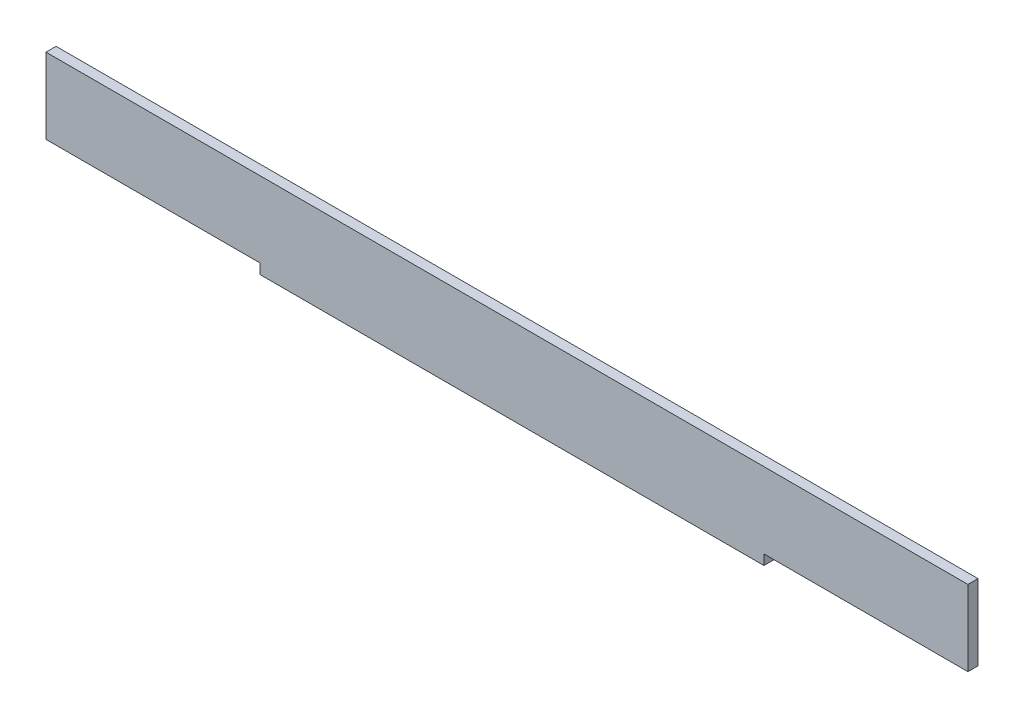
ISO-10303-21;
HEADER;
FILE_DESCRIPTION(('STEP AP214'),'2;1');
FILE_NAME('part.step','',(''),(''),'','','');
FILE_SCHEMA(('AUTOMOTIVE_DESIGN { 1 0 10303 214 1 1 1 1 }'));
ENDSEC;
DATA;
#1=APPLICATION_CONTEXT('core data for automotive mechanical design processes');
#2=APPLICATION_PROTOCOL_DEFINITION('international standard','automotive_design',2000,#1);
#3=PRODUCT_CONTEXT('',#1,'mechanical');
#4=PRODUCT('Part','Part','',(#3));
#5=PRODUCT_RELATED_PRODUCT_CATEGORY('part','',(#4));
#6=PRODUCT_DEFINITION_FORMATION('','',#4);
#7=PRODUCT_DEFINITION_CONTEXT('part definition',#1,'design');
#8=PRODUCT_DEFINITION('design','',#6,#7);
#9=PRODUCT_DEFINITION_SHAPE('','',#8);
#10=(LENGTH_UNIT() NAMED_UNIT(*) SI_UNIT(.MILLI.,.METRE.));
#11=(NAMED_UNIT(*) PLANE_ANGLE_UNIT() SI_UNIT($,.RADIAN.));
#12=(NAMED_UNIT(*) SI_UNIT($,.STERADIAN.) SOLID_ANGLE_UNIT());
#13=UNCERTAINTY_MEASURE_WITH_UNIT(LENGTH_MEASURE(1.E-05),#10,'distance_accuracy_value','');
#14=(GEOMETRIC_REPRESENTATION_CONTEXT(3) GLOBAL_UNCERTAINTY_ASSIGNED_CONTEXT((#13)) GLOBAL_UNIT_ASSIGNED_CONTEXT((#10,
#11,#12)) REPRESENTATION_CONTEXT('',''));
#15=CARTESIAN_POINT('',(0.,0.,0.));
#16=DIRECTION('',(0.,0.,1.));
#17=DIRECTION('',(1.,0.,0.));
#18=AXIS2_PLACEMENT_3D('',#15,#16,#17);
#19=CARTESIAN_POINT('',(0.,4.,4.));
#20=DIRECTION('',(1.,0.,0.));
#21=DIRECTION('',(0.,0.,-1.));
#22=AXIS2_PLACEMENT_3D('',#19,#20,#21);
#23=PLANE('',#22);
#24=DIRECTION('',(0.,-1.,0.));
#25=VECTOR('',#24,1.);
#26=CARTESIAN_POINT('',(0.,4.,0.));
#27=LINE('',#26,#25);
#28=CARTESIAN_POINT('',(0.,4.,0.));
#29=VERTEX_POINT('',#28);
#30=CARTESIAN_POINT('',(0.,0.,0.));
#31=VERTEX_POINT('',#30);
#32=EDGE_CURVE('E141',#29,#31,#27,.T.);
#33=ORIENTED_EDGE('',*,*,#32,.T.);
#34=DIRECTION('',(0.,0.,-1.));
#35=VECTOR('',#34,1.);
#36=CARTESIAN_POINT('',(0.,0.,4.));
#37=LINE('',#36,#35);
#38=CARTESIAN_POINT('',(0.,0.,4.));
#39=VERTEX_POINT('',#38);
#40=EDGE_CURVE('E11',#39,#31,#37,.T.);
#41=ORIENTED_EDGE('',*,*,#40,.F.);
#42=DIRECTION('',(0.,-1.,0.));
#43=VECTOR('',#42,1.);
#44=CARTESIAN_POINT('',(0.,4.,4.));
#45=LINE('',#44,#43);
#46=CARTESIAN_POINT('',(0.,4.,4.));
#47=VERTEX_POINT('',#46);
#48=EDGE_CURVE('E156',#47,#39,#45,.T.);
#49=ORIENTED_EDGE('',*,*,#48,.F.);
#50=DIRECTION('',(0.,0.,-1.));
#51=VECTOR('',#50,1.);
#52=CARTESIAN_POINT('',(0.,4.,4.));
#53=LINE('',#52,#51);
#54=EDGE_CURVE('E137',#47,#29,#53,.T.);
#55=ORIENTED_EDGE('',*,*,#54,.T.);
#56=EDGE_LOOP('',(#33,#41,#49,#55));
#57=FACE_BOUND('',#56,.T.);
#58=ADVANCED_FACE('F46',(#57),#23,.F.);
#59=CARTESIAN_POINT('',(0.,0.,4.));
#60=DIRECTION('',(0.,1.,0.));
#61=DIRECTION('',(0.,0.,1.));
#62=AXIS2_PLACEMENT_3D('',#59,#60,#61);
#63=PLANE('',#62);
#64=DIRECTION('',(1.,0.,0.));
#65=VECTOR('',#64,1.);
#66=CARTESIAN_POINT('',(0.,0.,0.));
#67=LINE('',#66,#65);
#68=CARTESIAN_POINT('',(200.,0.,0.));
#69=VERTEX_POINT('',#68);
#70=EDGE_CURVE('E144',#31,#69,#67,.T.);
#71=ORIENTED_EDGE('',*,*,#70,.T.);
#72=DIRECTION('',(0.,0.,-1.));
#73=VECTOR('',#72,1.);
#74=CARTESIAN_POINT('',(200.,0.,4.));
#75=LINE('',#74,#73);
#76=CARTESIAN_POINT('',(200.,0.,4.));
#77=VERTEX_POINT('',#76);
#78=EDGE_CURVE('E54',#77,#69,#75,.T.);
#79=ORIENTED_EDGE('',*,*,#78,.F.);
#80=DIRECTION('',(1.,0.,0.));
#81=VECTOR('',#80,1.);
#82=CARTESIAN_POINT('',(0.,0.,4.));
#83=LINE('',#82,#81);
#84=EDGE_CURVE('E105',#39,#77,#83,.T.);
#85=ORIENTED_EDGE('',*,*,#84,.F.);
#86=ORIENTED_EDGE('',*,*,#40,.T.);
#87=EDGE_LOOP('',(#71,#79,#85,#86));
#88=FACE_BOUND('',#87,.T.);
#89=ADVANCED_FACE('F191',(#88),#63,.F.);
#90=CARTESIAN_POINT('',(200.,0.,4.));
#91=DIRECTION('',(-1.,0.,0.));
#92=DIRECTION('',(0.,0.,1.));
#93=AXIS2_PLACEMENT_3D('',#90,#91,#92);
#94=PLANE('',#93);
#95=DIRECTION('',(0.,1.,0.));
#96=VECTOR('',#95,1.);
#97=CARTESIAN_POINT('',(200.,0.,0.));
#98=LINE('',#97,#96);
#99=CARTESIAN_POINT('',(200.,4.,0.));
#100=VERTEX_POINT('',#99);
#101=EDGE_CURVE('E146',#69,#100,#98,.T.);
#102=ORIENTED_EDGE('',*,*,#101,.T.);
#103=DIRECTION('',(0.,0.,-1.));
#104=VECTOR('',#103,1.);
#105=CARTESIAN_POINT('',(200.,4.,4.));
#106=LINE('',#105,#104);
#107=CARTESIAN_POINT('',(200.,4.,4.));
#108=VERTEX_POINT('',#107);
#109=EDGE_CURVE('E163',#108,#100,#106,.T.);
#110=ORIENTED_EDGE('',*,*,#109,.F.);
#111=DIRECTION('',(0.,1.,0.));
#112=VECTOR('',#111,1.);
#113=CARTESIAN_POINT('',(200.,0.,4.));
#114=LINE('',#113,#112);
#115=EDGE_CURVE('E171',#77,#108,#114,.T.);
#116=ORIENTED_EDGE('',*,*,#115,.F.);
#117=ORIENTED_EDGE('',*,*,#78,.T.);
#118=EDGE_LOOP('',(#102,#110,#116,#117));
#119=FACE_BOUND('',#118,.T.);
#120=ADVANCED_FACE('F169',(#119),#94,.F.);
#121=CARTESIAN_POINT('',(200.,4.,4.));
#122=DIRECTION('',(0.,1.,0.));
#123=DIRECTION('',(0.,0.,1.));
#124=AXIS2_PLACEMENT_3D('',#121,#122,#123);
#125=PLANE('',#124);
#126=DIRECTION('',(1.,0.,0.));
#127=VECTOR('',#126,1.);
#128=CARTESIAN_POINT('',(200.,4.,0.));
#129=LINE('',#128,#127);
#130=CARTESIAN_POINT('',(281.,4.,0.));
#131=VERTEX_POINT('',#130);
#132=EDGE_CURVE('E148',#100,#131,#129,.T.);
#133=ORIENTED_EDGE('',*,*,#132,.T.);
#134=DIRECTION('',(0.,0.,-1.));
#135=VECTOR('',#134,1.);
#136=CARTESIAN_POINT('',(281.,4.,4.));
#137=LINE('',#136,#135);
#138=CARTESIAN_POINT('',(281.,4.,4.));
#139=VERTEX_POINT('',#138);
#140=EDGE_CURVE('E160',#139,#131,#137,.T.);
#141=ORIENTED_EDGE('',*,*,#140,.F.);
#142=DIRECTION('',(1.,0.,0.));
#143=VECTOR('',#142,1.);
#144=CARTESIAN_POINT('',(200.,4.,4.));
#145=LINE('',#144,#143);
#146=EDGE_CURVE('E183',#108,#139,#145,.T.);
#147=ORIENTED_EDGE('',*,*,#146,.F.);
#148=ORIENTED_EDGE('',*,*,#109,.T.);
#149=EDGE_LOOP('',(#133,#141,#147,#148));
#150=FACE_BOUND('',#149,.T.);
#151=ADVANCED_FACE('F179',(#150),#125,.F.);
#152=CARTESIAN_POINT('',(281.,4.,4.));
#153=DIRECTION('',(-1.,0.,0.));
#154=DIRECTION('',(0.,0.,1.));
#155=AXIS2_PLACEMENT_3D('',#152,#153,#154);
#156=PLANE('',#155);
#157=DIRECTION('',(0.,1.,0.));
#158=VECTOR('',#157,1.);
#159=CARTESIAN_POINT('',(281.,4.,0.));
#160=LINE('',#159,#158);
#161=CARTESIAN_POINT('',(281.,34.,0.));
#162=VERTEX_POINT('',#161);
#163=EDGE_CURVE('E150',#131,#162,#160,.T.);
#164=ORIENTED_EDGE('',*,*,#163,.T.);
#165=DIRECTION('',(0.,0.,-1.));
#166=VECTOR('',#165,1.);
#167=CARTESIAN_POINT('',(281.,34.,4.));
#168=LINE('',#167,#166);
#169=CARTESIAN_POINT('',(281.,34.,4.));
#170=VERTEX_POINT('',#169);
#171=EDGE_CURVE('E132',#170,#162,#168,.T.);
#172=ORIENTED_EDGE('',*,*,#171,.F.);
#173=DIRECTION('',(0.,1.,0.));
#174=VECTOR('',#173,1.);
#175=CARTESIAN_POINT('',(281.,4.,4.));
#176=LINE('',#175,#174);
#177=EDGE_CURVE('E124',#139,#170,#176,.T.);
#178=ORIENTED_EDGE('',*,*,#177,.F.);
#179=ORIENTED_EDGE('',*,*,#140,.T.);
#180=EDGE_LOOP('',(#164,#172,#178,#179));
#181=FACE_BOUND('',#180,.T.);
#182=ADVANCED_FACE('F182',(#181),#156,.F.);
#183=CARTESIAN_POINT('',(0.,34.,4.));
#184=DIRECTION('',(0.,-1.,0.));
#185=DIRECTION('',(0.,0.,-1.));
#186=AXIS2_PLACEMENT_3D('',#183,#184,#185);
#187=PLANE('',#186);
#188=DIRECTION('',(-1.,0.,0.));
#189=VECTOR('',#188,1.);
#190=CARTESIAN_POINT('',(0.,34.,0.));
#191=LINE('',#190,#189);
#192=CARTESIAN_POINT('',(-85.,34.,0.));
#193=VERTEX_POINT('',#192);
#194=EDGE_CURVE('E131',#162,#193,#191,.T.);
#195=ORIENTED_EDGE('',*,*,#194,.T.);
#196=DIRECTION('',(0.,0.,-1.));
#197=VECTOR('',#196,1.);
#198=CARTESIAN_POINT('',(-85.,34.,4.));
#199=LINE('',#198,#197);
#200=CARTESIAN_POINT('',(-85.,34.,4.));
#201=VERTEX_POINT('',#200);
#202=EDGE_CURVE('E129',#201,#193,#199,.T.);
#203=ORIENTED_EDGE('',*,*,#202,.F.);
#204=DIRECTION('',(-1.,0.,0.));
#205=VECTOR('',#204,1.);
#206=CARTESIAN_POINT('',(281.,34.,4.));
#207=LINE('',#206,#205);
#208=EDGE_CURVE('E118',#170,#201,#207,.T.);
#209=ORIENTED_EDGE('',*,*,#208,.F.);
#210=ORIENTED_EDGE('',*,*,#171,.T.);
#211=EDGE_LOOP('',(#195,#203,#209,#210));
#212=FACE_BOUND('',#211,.T.);
#213=ADVANCED_FACE('F130',(#212),#187,.F.);
#214=CARTESIAN_POINT('',(-85.,34.,4.));
#215=DIRECTION('',(1.,0.,0.));
#216=DIRECTION('',(0.,0.,-1.));
#217=AXIS2_PLACEMENT_3D('',#214,#215,#216);
#218=PLANE('',#217);
#219=DIRECTION('',(0.,-1.,0.));
#220=VECTOR('',#219,1.);
#221=CARTESIAN_POINT('',(-85.,34.,0.));
#222=LINE('',#221,#220);
#223=CARTESIAN_POINT('',(-85.,4.,0.));
#224=VERTEX_POINT('',#223);
#225=EDGE_CURVE('E91',#193,#224,#222,.T.);
#226=ORIENTED_EDGE('',*,*,#225,.T.);
#227=DIRECTION('',(0.,0.,-1.));
#228=VECTOR('',#227,1.);
#229=CARTESIAN_POINT('',(-85.,4.,4.));
#230=LINE('',#229,#228);
#231=CARTESIAN_POINT('',(-85.,4.,4.));
#232=VERTEX_POINT('',#231);
#233=EDGE_CURVE('E133',#232,#224,#230,.T.);
#234=ORIENTED_EDGE('',*,*,#233,.F.);
#235=DIRECTION('',(0.,-1.,0.));
#236=VECTOR('',#235,1.);
#237=CARTESIAN_POINT('',(-85.,34.,4.));
#238=LINE('',#237,#236);
#239=EDGE_CURVE('E122',#201,#232,#238,.T.);
#240=ORIENTED_EDGE('',*,*,#239,.F.);
#241=ORIENTED_EDGE('',*,*,#202,.T.);
#242=EDGE_LOOP('',(#226,#234,#240,#241));
#243=FACE_BOUND('',#242,.T.);
#244=ADVANCED_FACE('F135',(#243),#218,.F.);
#245=CARTESIAN_POINT('',(-85.,4.,4.));
#246=DIRECTION('',(0.,1.,0.));
#247=DIRECTION('',(0.,0.,1.));
#248=AXIS2_PLACEMENT_3D('',#245,#246,#247);
#249=PLANE('',#248);
#250=DIRECTION('',(1.,0.,0.));
#251=VECTOR('',#250,1.);
#252=CARTESIAN_POINT('',(-85.,4.,0.));
#253=LINE('',#252,#251);
#254=EDGE_CURVE('E97',#224,#29,#253,.T.);
#255=ORIENTED_EDGE('',*,*,#254,.T.);
#256=ORIENTED_EDGE('',*,*,#54,.F.);
#257=DIRECTION('',(1.,0.,0.));
#258=VECTOR('',#257,1.);
#259=CARTESIAN_POINT('',(-85.,4.,4.));
#260=LINE('',#259,#258);
#261=EDGE_CURVE('E62',#232,#47,#260,.T.);
#262=ORIENTED_EDGE('',*,*,#261,.F.);
#263=ORIENTED_EDGE('',*,*,#233,.T.);
#264=EDGE_LOOP('',(#255,#256,#262,#263));
#265=FACE_BOUND('',#264,.T.);
#266=ADVANCED_FACE('F207',(#265),#249,.F.);
#267=CARTESIAN_POINT('',(0.,0.,4.));
#268=DIRECTION('',(0.,0.,1.));
#269=DIRECTION('',(1.,0.,0.));
#270=AXIS2_PLACEMENT_3D('',#267,#268,#269);
#271=PLANE('',#270);
#272=ORIENTED_EDGE('',*,*,#48,.T.);
#273=ORIENTED_EDGE('',*,*,#84,.T.);
#274=ORIENTED_EDGE('',*,*,#115,.T.);
#275=ORIENTED_EDGE('',*,*,#146,.T.);
#276=ORIENTED_EDGE('',*,*,#177,.T.);
#277=ORIENTED_EDGE('',*,*,#208,.T.);
#278=ORIENTED_EDGE('',*,*,#239,.T.);
#279=ORIENTED_EDGE('',*,*,#261,.T.);
#280=EDGE_LOOP('',(#272,#273,#274,#275,#276,#277,#278,#279));
#281=FACE_BOUND('',#280,.T.);
#282=ADVANCED_FACE('F120',(#281),#271,.T.);
#283=CARTESIAN_POINT('',(0.,0.,0.));
#284=DIRECTION('',(0.,0.,1.));
#285=DIRECTION('',(1.,0.,0.));
#286=AXIS2_PLACEMENT_3D('',#283,#284,#285);
#287=PLANE('',#286);
#288=ORIENTED_EDGE('',*,*,#32,.F.);
#289=ORIENTED_EDGE('',*,*,#254,.F.);
#290=ORIENTED_EDGE('',*,*,#225,.F.);
#291=ORIENTED_EDGE('',*,*,#194,.F.);
#292=ORIENTED_EDGE('',*,*,#163,.F.);
#293=ORIENTED_EDGE('',*,*,#132,.F.);
#294=ORIENTED_EDGE('',*,*,#101,.F.);
#295=ORIENTED_EDGE('',*,*,#70,.F.);
#296=EDGE_LOOP('',(#288,#289,#290,#291,#292,#293,#294,#295));
#297=FACE_BOUND('',#296,.T.);
#298=ADVANCED_FACE('F175',(#297),#287,.F.);
#299=CLOSED_SHELL('',(#58,#89,#120,#151,#182,#213,#244,#266,#282,#298));
#300=MANIFOLD_SOLID_BREP('B2',#299);
#301=ADVANCED_BREP_SHAPE_REPRESENTATION('',(#18,#300),#14);
#302=SHAPE_DEFINITION_REPRESENTATION(#9,#301);
ENDSEC;
END-ISO-10303-21;
